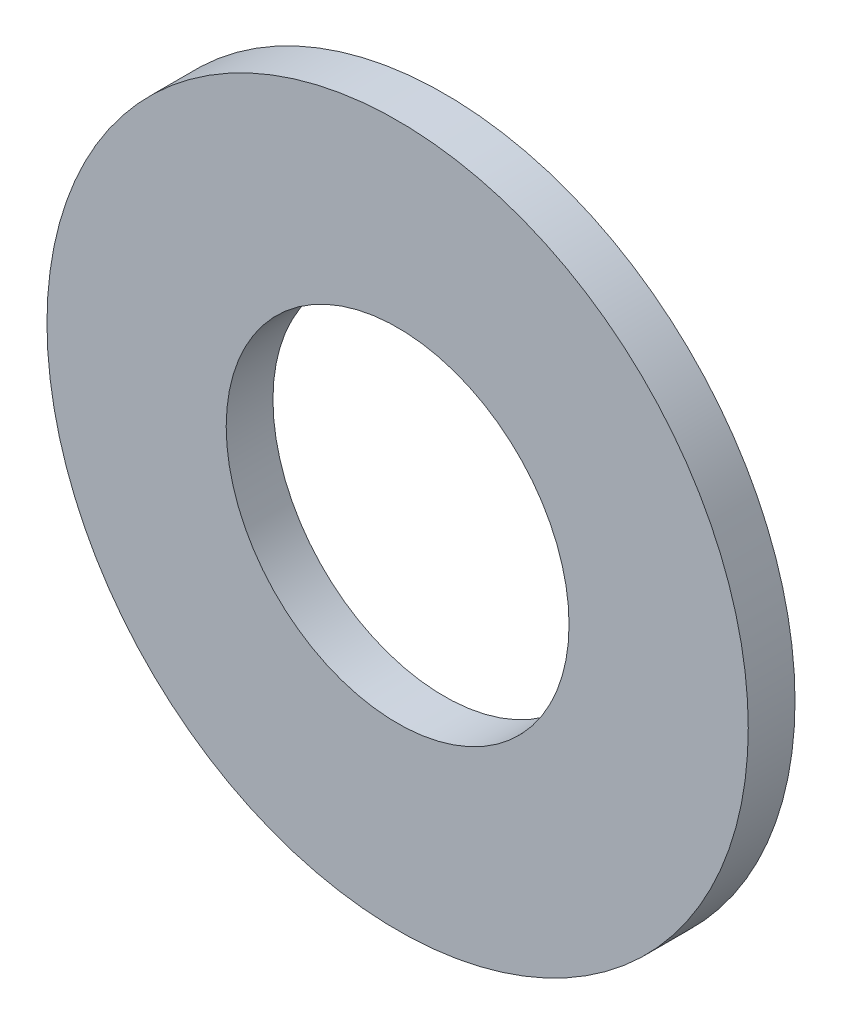
ISO-10303-21;
HEADER;
FILE_DESCRIPTION(('STEP AP214'),'2;1');
FILE_NAME('part.step','',(''),(''),'','','');
FILE_SCHEMA(('AUTOMOTIVE_DESIGN { 1 0 10303 214 1 1 1 1 }'));
ENDSEC;
DATA;
#1=APPLICATION_CONTEXT('core data for automotive mechanical design processes');
#2=APPLICATION_PROTOCOL_DEFINITION('international standard','automotive_design',2000,#1);
#3=PRODUCT_CONTEXT('',#1,'mechanical');
#4=PRODUCT('Part','Part','',(#3));
#5=PRODUCT_RELATED_PRODUCT_CATEGORY('part','',(#4));
#6=PRODUCT_DEFINITION_FORMATION('','',#4);
#7=PRODUCT_DEFINITION_CONTEXT('part definition',#1,'design');
#8=PRODUCT_DEFINITION('design','',#6,#7);
#9=PRODUCT_DEFINITION_SHAPE('','',#8);
#10=(LENGTH_UNIT() NAMED_UNIT(*) SI_UNIT(.MILLI.,.METRE.));
#11=(NAMED_UNIT(*) PLANE_ANGLE_UNIT() SI_UNIT($,.RADIAN.));
#12=(NAMED_UNIT(*) SI_UNIT($,.STERADIAN.) SOLID_ANGLE_UNIT());
#13=UNCERTAINTY_MEASURE_WITH_UNIT(LENGTH_MEASURE(1.E-05),#10,'distance_accuracy_value','');
#14=(GEOMETRIC_REPRESENTATION_CONTEXT(3) GLOBAL_UNCERTAINTY_ASSIGNED_CONTEXT((#13)) GLOBAL_UNIT_ASSIGNED_CONTEXT((#10,
#11,#12)) REPRESENTATION_CONTEXT('',''));
#15=CARTESIAN_POINT('',(0.,0.,0.));
#16=DIRECTION('',(0.,0.,1.));
#17=DIRECTION('',(1.,0.,0.));
#18=AXIS2_PLACEMENT_3D('',#15,#16,#17);
#19=CARTESIAN_POINT('',(0.,0.,0.));
#20=DIRECTION('',(0.,0.,1.));
#21=DIRECTION('',(1.,0.,0.));
#22=AXIS2_PLACEMENT_3D('',#19,#20,#21);
#23=PLANE('',#22);
#24=CARTESIAN_POINT('',(0.,0.,0.));
#25=DIRECTION('',(0.,0.,1.));
#26=DIRECTION('',(1.,0.,0.));
#27=AXIS2_PLACEMENT_3D('',#24,#25,#26);
#28=CIRCLE('',#27,2.25);
#29=CARTESIAN_POINT('',(2.25,0.,0.));
#30=VERTEX_POINT('',#29);
#31=EDGE_CURVE('E28',#30,#30,#28,.F.);
#32=ORIENTED_EDGE('',*,*,#31,.F.);
#33=EDGE_LOOP('',(#32));
#34=FACE_BOUND('',#33,.T.);
#35=CARTESIAN_POINT('',(0.,0.,0.));
#36=DIRECTION('',(0.,0.,1.));
#37=DIRECTION('',(1.,0.,0.));
#38=AXIS2_PLACEMENT_3D('',#35,#36,#37);
#39=CIRCLE('',#38,1.1);
#40=CARTESIAN_POINT('',(1.1,0.,0.));
#41=VERTEX_POINT('',#40);
#42=EDGE_CURVE('E19',#41,#41,#39,.F.);
#43=ORIENTED_EDGE('',*,*,#42,.T.);
#44=EDGE_LOOP('',(#43));
#45=FACE_BOUND('',#44,.T.);
#46=ADVANCED_FACE('F16',(#34,#45),#23,.T.);
#47=CARTESIAN_POINT('',(0.,0.,-0.3));
#48=DIRECTION('',(0.,0.,1.));
#49=DIRECTION('',(1.,0.,0.));
#50=AXIS2_PLACEMENT_3D('',#47,#48,#49);
#51=CYLINDRICAL_SURFACE('',#50,1.1);
#52=CARTESIAN_POINT('',(0.,0.,-0.3));
#53=DIRECTION('',(0.,0.,1.));
#54=DIRECTION('',(1.,0.,0.));
#55=AXIS2_PLACEMENT_3D('',#52,#53,#54);
#56=CIRCLE('',#55,1.1);
#57=CARTESIAN_POINT('',(1.1,0.,-0.3));
#58=VERTEX_POINT('',#57);
#59=EDGE_CURVE('E23',#58,#58,#56,.F.);
#60=ORIENTED_EDGE('',*,*,#59,.T.);
#61=EDGE_LOOP('',(#60));
#62=FACE_BOUND('',#61,.T.);
#63=ORIENTED_EDGE('',*,*,#42,.F.);
#64=EDGE_LOOP('',(#63));
#65=FACE_BOUND('',#64,.T.);
#66=ADVANCED_FACE('F37',(#62,#65),#51,.F.);
#67=CARTESIAN_POINT('',(0.,0.,-0.3));
#68=DIRECTION('',(0.,0.,1.));
#69=DIRECTION('',(1.,0.,0.));
#70=AXIS2_PLACEMENT_3D('',#67,#68,#69);
#71=CYLINDRICAL_SURFACE('',#70,2.25);
#72=ORIENTED_EDGE('',*,*,#31,.T.);
#73=EDGE_LOOP('',(#72));
#74=FACE_BOUND('',#73,.T.);
#75=CARTESIAN_POINT('',(0.,0.,-0.3));
#76=DIRECTION('',(0.,0.,1.));
#77=DIRECTION('',(1.,0.,0.));
#78=AXIS2_PLACEMENT_3D('',#75,#76,#77);
#79=CIRCLE('',#78,2.25);
#80=CARTESIAN_POINT('',(2.25,0.,-0.3));
#81=VERTEX_POINT('',#80);
#82=EDGE_CURVE('E10',#81,#81,#79,.T.);
#83=ORIENTED_EDGE('',*,*,#82,.T.);
#84=EDGE_LOOP('',(#83));
#85=FACE_BOUND('',#84,.T.);
#86=ADVANCED_FACE('F39',(#74,#85),#71,.T.);
#87=CARTESIAN_POINT('',(0.,0.,-0.3));
#88=DIRECTION('',(0.,0.,1.));
#89=DIRECTION('',(1.,0.,0.));
#90=AXIS2_PLACEMENT_3D('',#87,#88,#89);
#91=PLANE('',#90);
#92=ORIENTED_EDGE('',*,*,#82,.F.);
#93=EDGE_LOOP('',(#92));
#94=FACE_BOUND('',#93,.T.);
#95=ORIENTED_EDGE('',*,*,#59,.F.);
#96=EDGE_LOOP('',(#95));
#97=FACE_BOUND('',#96,.T.);
#98=ADVANCED_FACE('F46',(#94,#97),#91,.F.);
#99=CLOSED_SHELL('',(#46,#66,#86,#98));
#100=MANIFOLD_SOLID_BREP('B1',#99);
#101=ADVANCED_BREP_SHAPE_REPRESENTATION('',(#18,#100),#14);
#102=SHAPE_DEFINITION_REPRESENTATION(#9,#101);
ENDSEC;
END-ISO-10303-21;
